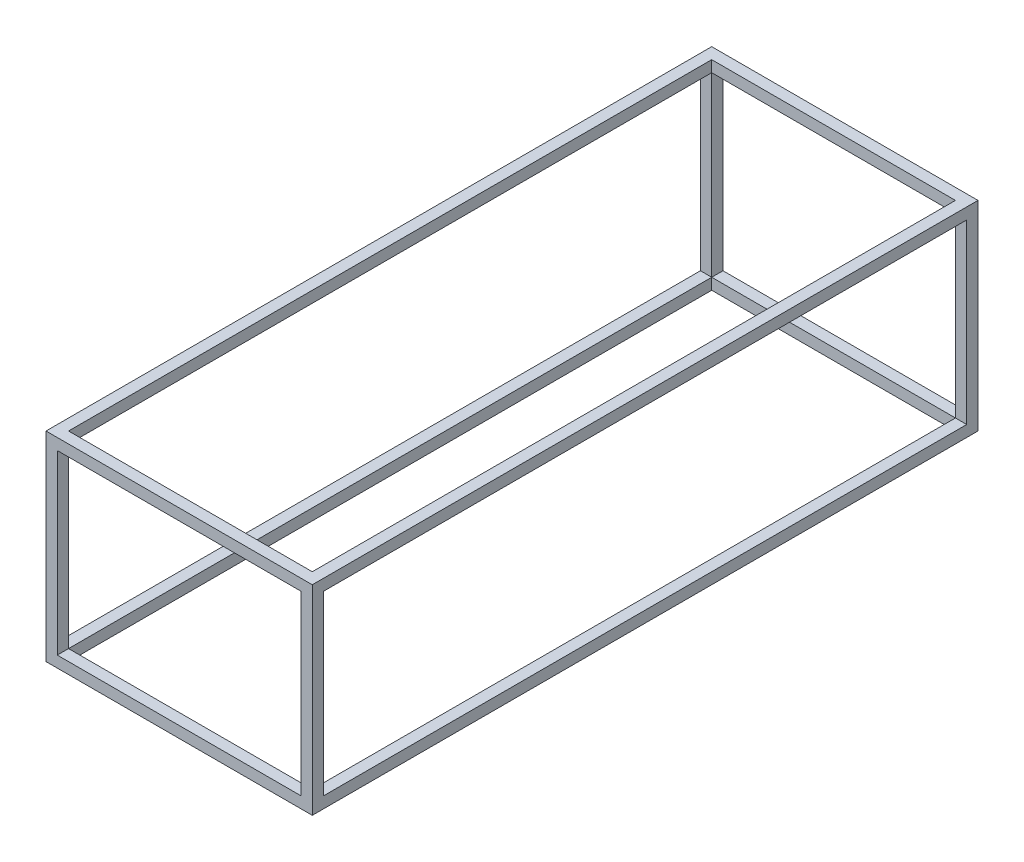
ISO-10303-21;
HEADER;
FILE_DESCRIPTION(('STEP AP214'),'2;1');
FILE_NAME('part.step','',(''),(''),'','','');
FILE_SCHEMA(('AUTOMOTIVE_DESIGN { 1 0 10303 214 1 1 1 1 }'));
ENDSEC;
DATA;
#1=APPLICATION_CONTEXT('core data for automotive mechanical design processes');
#2=APPLICATION_PROTOCOL_DEFINITION('international standard','automotive_design',2000,#1);
#3=PRODUCT_CONTEXT('',#1,'mechanical');
#4=PRODUCT('Part','Part','',(#3));
#5=PRODUCT_RELATED_PRODUCT_CATEGORY('part','',(#4));
#6=PRODUCT_DEFINITION_FORMATION('','',#4);
#7=PRODUCT_DEFINITION_CONTEXT('part definition',#1,'design');
#8=PRODUCT_DEFINITION('design','',#6,#7);
#9=PRODUCT_DEFINITION_SHAPE('','',#8);
#10=(LENGTH_UNIT() NAMED_UNIT(*) SI_UNIT(.MILLI.,.METRE.));
#11=(NAMED_UNIT(*) PLANE_ANGLE_UNIT() SI_UNIT($,.RADIAN.));
#12=(NAMED_UNIT(*) SI_UNIT($,.STERADIAN.) SOLID_ANGLE_UNIT());
#13=UNCERTAINTY_MEASURE_WITH_UNIT(LENGTH_MEASURE(1.E-05),#10,'distance_accuracy_value','');
#14=(GEOMETRIC_REPRESENTATION_CONTEXT(3) GLOBAL_UNCERTAINTY_ASSIGNED_CONTEXT((#13)) GLOBAL_UNIT_ASSIGNED_CONTEXT((#10,
#11,#12)) REPRESENTATION_CONTEXT('',''));
#15=CARTESIAN_POINT('',(0.,0.,0.));
#16=DIRECTION('',(0.,0.,1.));
#17=DIRECTION('',(1.,0.,0.));
#18=AXIS2_PLACEMENT_3D('',#15,#16,#17);
#19=CARTESIAN_POINT('',(25.4,424.6,1500.));
#20=DIRECTION('',(0.,-1.,0.));
#21=DIRECTION('',(0.,0.,-1.));
#22=AXIS2_PLACEMENT_3D('',#19,#20,#21);
#23=PLANE('',#22);
#24=DIRECTION('',(0.,0.,-1.));
#25=VECTOR('',#24,1.);
#26=CARTESIAN_POINT('',(25.4,424.6,1500.));
#27=LINE('',#26,#25);
#28=CARTESIAN_POINT('',(25.4,424.6,1474.6));
#29=VERTEX_POINT('',#28);
#30=CARTESIAN_POINT('',(25.4,424.6,25.4000000000001));
#31=VERTEX_POINT('',#30);
#32=EDGE_CURVE('E282',#29,#31,#27,.T.);
#33=ORIENTED_EDGE('',*,*,#32,.F.);
#34=DIRECTION('',(-1.,0.,0.));
#35=VECTOR('',#34,1.);
#36=CARTESIAN_POINT('',(25.4,424.6,1474.6));
#37=LINE('',#36,#35);
#38=CARTESIAN_POINT('',(0.,424.6,1474.6));
#39=VERTEX_POINT('',#38);
#40=EDGE_CURVE('E52',#29,#39,#37,.T.);
#41=ORIENTED_EDGE('',*,*,#40,.T.);
#42=DIRECTION('',(0.,0.,-1.));
#43=VECTOR('',#42,1.);
#44=CARTESIAN_POINT('',(0.,424.6,1500.));
#45=LINE('',#44,#43);
#46=CARTESIAN_POINT('',(0.,424.6,25.4));
#47=VERTEX_POINT('',#46);
#48=EDGE_CURVE('E286',#39,#47,#45,.T.);
#49=ORIENTED_EDGE('',*,*,#48,.T.);
#50=DIRECTION('',(-1.,0.,0.));
#51=VECTOR('',#50,1.);
#52=CARTESIAN_POINT('',(0.,424.6,25.4));
#53=LINE('',#52,#51);
#54=EDGE_CURVE('E291',#31,#47,#53,.T.);
#55=ORIENTED_EDGE('',*,*,#54,.F.);
#56=EDGE_LOOP('',(#33,#41,#49,#55));
#57=FACE_BOUND('',#56,.T.);
#58=ADVANCED_FACE('F37',(#57),#23,.T.);
#59=CARTESIAN_POINT('',(25.4,424.6,1500.));
#60=DIRECTION('',(1.,0.,0.));
#61=DIRECTION('',(0.,0.,-1.));
#62=AXIS2_PLACEMENT_3D('',#59,#60,#61);
#63=PLANE('',#62);
#64=DIRECTION('',(0.,0.,-1.));
#65=VECTOR('',#64,1.);
#66=CARTESIAN_POINT('',(25.4,450.,1500.));
#67=LINE('',#66,#65);
#68=CARTESIAN_POINT('',(25.4,450.,1474.6));
#69=VERTEX_POINT('',#68);
#70=CARTESIAN_POINT('',(25.4,450.,25.4000000000001));
#71=VERTEX_POINT('',#70);
#72=EDGE_CURVE('E283',#69,#71,#67,.T.);
#73=ORIENTED_EDGE('',*,*,#72,.F.);
#74=DIRECTION('',(0.,-1.,0.));
#75=VECTOR('',#74,1.);
#76=CARTESIAN_POINT('',(25.4,424.6,1474.6));
#77=LINE('',#76,#75);
#78=EDGE_CURVE('E60',#69,#29,#77,.T.);
#79=ORIENTED_EDGE('',*,*,#78,.T.);
#80=ORIENTED_EDGE('',*,*,#32,.T.);
#81=DIRECTION('',(0.,-1.,0.));
#82=VECTOR('',#81,1.);
#83=CARTESIAN_POINT('',(25.4,0.,25.4));
#84=LINE('',#83,#82);
#85=EDGE_CURVE('E285',#71,#31,#84,.T.);
#86=ORIENTED_EDGE('',*,*,#85,.F.);
#87=EDGE_LOOP('',(#73,#79,#80,#86));
#88=FACE_BOUND('',#87,.T.);
#89=ADVANCED_FACE('F394',(#88),#63,.T.);
#90=CARTESIAN_POINT('',(574.6,424.6,1500.));
#91=DIRECTION('',(0.,-1.,0.));
#92=DIRECTION('',(0.,0.,-1.));
#93=AXIS2_PLACEMENT_3D('',#90,#91,#92);
#94=PLANE('',#93);
#95=DIRECTION('',(0.,0.,-1.));
#96=VECTOR('',#95,1.);
#97=CARTESIAN_POINT('',(600.,424.6,1500.));
#98=LINE('',#97,#96);
#99=CARTESIAN_POINT('',(600.,424.6,1474.6));
#100=VERTEX_POINT('',#99);
#101=CARTESIAN_POINT('',(600.,424.6,25.4));
#102=VERTEX_POINT('',#101);
#103=EDGE_CURVE('E269',#100,#102,#98,.T.);
#104=ORIENTED_EDGE('',*,*,#103,.F.);
#105=DIRECTION('',(-1.,0.,0.));
#106=VECTOR('',#105,1.);
#107=CARTESIAN_POINT('',(574.6,424.6,1474.6));
#108=LINE('',#107,#106);
#109=CARTESIAN_POINT('',(574.6,424.6,1474.6));
#110=VERTEX_POINT('',#109);
#111=EDGE_CURVE('E232',#100,#110,#108,.T.);
#112=ORIENTED_EDGE('',*,*,#111,.T.);
#113=DIRECTION('',(0.,0.,-1.));
#114=VECTOR('',#113,1.);
#115=CARTESIAN_POINT('',(574.6,424.6,1500.));
#116=LINE('',#115,#114);
#117=CARTESIAN_POINT('',(574.6,424.6,25.4));
#118=VERTEX_POINT('',#117);
#119=EDGE_CURVE('E266',#110,#118,#116,.T.);
#120=ORIENTED_EDGE('',*,*,#119,.T.);
#121=DIRECTION('',(-1.,0.,0.));
#122=VECTOR('',#121,1.);
#123=CARTESIAN_POINT('',(0.,424.6,25.4));
#124=LINE('',#123,#122);
#125=EDGE_CURVE('E274',#102,#118,#124,.T.);
#126=ORIENTED_EDGE('',*,*,#125,.F.);
#127=EDGE_LOOP('',(#104,#112,#120,#126));
#128=FACE_BOUND('',#127,.T.);
#129=ADVANCED_FACE('F399',(#128),#94,.T.);
#130=CARTESIAN_POINT('',(574.6,424.6,1500.));
#131=DIRECTION('',(-1.,0.,0.));
#132=DIRECTION('',(0.,0.,1.));
#133=AXIS2_PLACEMENT_3D('',#130,#131,#132);
#134=PLANE('',#133);
#135=ORIENTED_EDGE('',*,*,#119,.F.);
#136=DIRECTION('',(0.,1.,0.));
#137=VECTOR('',#136,1.);
#138=CARTESIAN_POINT('',(574.6,424.6,1474.6));
#139=LINE('',#138,#137);
#140=CARTESIAN_POINT('',(574.6,450.,1474.6));
#141=VERTEX_POINT('',#140);
#142=EDGE_CURVE('E230',#110,#141,#139,.T.);
#143=ORIENTED_EDGE('',*,*,#142,.T.);
#144=DIRECTION('',(0.,0.,-1.));
#145=VECTOR('',#144,1.);
#146=CARTESIAN_POINT('',(574.6,450.,1500.));
#147=LINE('',#146,#145);
#148=CARTESIAN_POINT('',(574.6,450.,25.4000000000001));
#149=VERTEX_POINT('',#148);
#150=EDGE_CURVE('E265',#141,#149,#147,.T.);
#151=ORIENTED_EDGE('',*,*,#150,.T.);
#152=DIRECTION('',(0.,1.,0.));
#153=VECTOR('',#152,1.);
#154=CARTESIAN_POINT('',(574.6,0.,25.4));
#155=LINE('',#154,#153);
#156=EDGE_CURVE('E268',#118,#149,#155,.T.);
#157=ORIENTED_EDGE('',*,*,#156,.F.);
#158=EDGE_LOOP('',(#135,#143,#151,#157));
#159=FACE_BOUND('',#158,.T.);
#160=ADVANCED_FACE('F494',(#159),#134,.T.);
#161=CARTESIAN_POINT('',(574.6,25.4,1500.));
#162=DIRECTION('',(-1.,0.,0.));
#163=DIRECTION('',(0.,0.,1.));
#164=AXIS2_PLACEMENT_3D('',#161,#162,#163);
#165=PLANE('',#164);
#166=DIRECTION('',(0.,0.,-1.));
#167=VECTOR('',#166,1.);
#168=CARTESIAN_POINT('',(574.6,0.,1500.));
#169=LINE('',#168,#167);
#170=CARTESIAN_POINT('',(574.6,0.,1474.6));
#171=VERTEX_POINT('',#170);
#172=CARTESIAN_POINT('',(574.6,0.,25.4000000000001));
#173=VERTEX_POINT('',#172);
#174=EDGE_CURVE('E252',#171,#173,#169,.T.);
#175=ORIENTED_EDGE('',*,*,#174,.F.);
#176=DIRECTION('',(0.,1.,0.));
#177=VECTOR('',#176,1.);
#178=CARTESIAN_POINT('',(574.6,25.4,1474.6));
#179=LINE('',#178,#177);
#180=CARTESIAN_POINT('',(574.6,25.4,1474.6));
#181=VERTEX_POINT('',#180);
#182=EDGE_CURVE('E228',#171,#181,#179,.T.);
#183=ORIENTED_EDGE('',*,*,#182,.T.);
#184=DIRECTION('',(0.,0.,-1.));
#185=VECTOR('',#184,1.);
#186=CARTESIAN_POINT('',(574.6,25.4,1500.));
#187=LINE('',#186,#185);
#188=CARTESIAN_POINT('',(574.6,25.4,25.4000000000001));
#189=VERTEX_POINT('',#188);
#190=EDGE_CURVE('E251',#181,#189,#187,.T.);
#191=ORIENTED_EDGE('',*,*,#190,.T.);
#192=DIRECTION('',(0.,1.,0.));
#193=VECTOR('',#192,1.);
#194=CARTESIAN_POINT('',(574.6,0.,25.4));
#195=LINE('',#194,#193);
#196=EDGE_CURVE('E260',#173,#189,#195,.T.);
#197=ORIENTED_EDGE('',*,*,#196,.F.);
#198=EDGE_LOOP('',(#175,#183,#191,#197));
#199=FACE_BOUND('',#198,.T.);
#200=ADVANCED_FACE('F490',(#199),#165,.T.);
#201=CARTESIAN_POINT('',(574.6,25.4,1500.));
#202=DIRECTION('',(0.,1.,0.));
#203=DIRECTION('',(0.,0.,1.));
#204=AXIS2_PLACEMENT_3D('',#201,#202,#203);
#205=PLANE('',#204);
#206=ORIENTED_EDGE('',*,*,#190,.F.);
#207=DIRECTION('',(1.,0.,0.));
#208=VECTOR('',#207,1.);
#209=CARTESIAN_POINT('',(574.6,25.4,1474.6));
#210=LINE('',#209,#208);
#211=CARTESIAN_POINT('',(600.,25.4,1474.6));
#212=VERTEX_POINT('',#211);
#213=EDGE_CURVE('E226',#181,#212,#210,.T.);
#214=ORIENTED_EDGE('',*,*,#213,.T.);
#215=DIRECTION('',(0.,0.,-1.));
#216=VECTOR('',#215,1.);
#217=CARTESIAN_POINT('',(600.,25.4,1500.));
#218=LINE('',#217,#216);
#219=CARTESIAN_POINT('',(600.,25.4,25.4));
#220=VERTEX_POINT('',#219);
#221=EDGE_CURVE('E255',#212,#220,#218,.T.);
#222=ORIENTED_EDGE('',*,*,#221,.T.);
#223=DIRECTION('',(1.,0.,0.));
#224=VECTOR('',#223,1.);
#225=CARTESIAN_POINT('',(0.,25.4,25.4));
#226=LINE('',#225,#224);
#227=EDGE_CURVE('E254',#189,#220,#226,.T.);
#228=ORIENTED_EDGE('',*,*,#227,.F.);
#229=EDGE_LOOP('',(#206,#214,#222,#228));
#230=FACE_BOUND('',#229,.T.);
#231=ADVANCED_FACE('F487',(#230),#205,.T.);
#232=CARTESIAN_POINT('',(0.,25.4,1500.));
#233=DIRECTION('',(0.,1.,0.));
#234=DIRECTION('',(0.,0.,1.));
#235=AXIS2_PLACEMENT_3D('',#232,#233,#234);
#236=PLANE('',#235);
#237=DIRECTION('',(0.,0.,-1.));
#238=VECTOR('',#237,1.);
#239=CARTESIAN_POINT('',(0.,25.4,1500.));
#240=LINE('',#239,#238);
#241=CARTESIAN_POINT('',(0.,25.4,1474.6));
#242=VERTEX_POINT('',#241);
#243=CARTESIAN_POINT('',(0.,25.4,25.4000000000001));
#244=VERTEX_POINT('',#243);
#245=EDGE_CURVE('E236',#242,#244,#240,.T.);
#246=ORIENTED_EDGE('',*,*,#245,.F.);
#247=DIRECTION('',(1.,0.,0.));
#248=VECTOR('',#247,1.);
#249=CARTESIAN_POINT('',(0.,25.4,1474.6));
#250=LINE('',#249,#248);
#251=CARTESIAN_POINT('',(25.4,25.4,1474.6));
#252=VERTEX_POINT('',#251);
#253=EDGE_CURVE('E224',#242,#252,#250,.T.);
#254=ORIENTED_EDGE('',*,*,#253,.T.);
#255=DIRECTION('',(0.,0.,-1.));
#256=VECTOR('',#255,1.);
#257=CARTESIAN_POINT('',(25.4,25.4,1500.));
#258=LINE('',#257,#256);
#259=CARTESIAN_POINT('',(25.4,25.4,25.4));
#260=VERTEX_POINT('',#259);
#261=EDGE_CURVE('E240',#252,#260,#258,.T.);
#262=ORIENTED_EDGE('',*,*,#261,.T.);
#263=DIRECTION('',(1.,0.,0.));
#264=VECTOR('',#263,1.);
#265=CARTESIAN_POINT('',(0.,25.4,25.4));
#266=LINE('',#265,#264);
#267=EDGE_CURVE('E245',#244,#260,#266,.T.);
#268=ORIENTED_EDGE('',*,*,#267,.F.);
#269=EDGE_LOOP('',(#246,#254,#262,#268));
#270=FACE_BOUND('',#269,.T.);
#271=ADVANCED_FACE('F437',(#270),#236,.T.);
#272=CARTESIAN_POINT('',(25.4,0.,1500.));
#273=DIRECTION('',(1.,0.,0.));
#274=DIRECTION('',(0.,0.,-1.));
#275=AXIS2_PLACEMENT_3D('',#272,#273,#274);
#276=PLANE('',#275);
#277=ORIENTED_EDGE('',*,*,#261,.F.);
#278=DIRECTION('',(0.,-1.,0.));
#279=VECTOR('',#278,1.);
#280=CARTESIAN_POINT('',(25.4,0.,1474.6));
#281=LINE('',#280,#279);
#282=CARTESIAN_POINT('',(25.4,0.,1474.6));
#283=VERTEX_POINT('',#282);
#284=EDGE_CURVE('E11',#252,#283,#281,.T.);
#285=ORIENTED_EDGE('',*,*,#284,.T.);
#286=DIRECTION('',(0.,0.,-1.));
#287=VECTOR('',#286,1.);
#288=CARTESIAN_POINT('',(25.4,0.,1500.));
#289=LINE('',#288,#287);
#290=CARTESIAN_POINT('',(25.4,0.,25.4000000000001));
#291=VERTEX_POINT('',#290);
#292=EDGE_CURVE('E237',#283,#291,#289,.T.);
#293=ORIENTED_EDGE('',*,*,#292,.T.);
#294=DIRECTION('',(0.,-1.,0.));
#295=VECTOR('',#294,1.);
#296=CARTESIAN_POINT('',(25.4,0.,25.4));
#297=LINE('',#296,#295);
#298=EDGE_CURVE('E239',#260,#291,#297,.T.);
#299=ORIENTED_EDGE('',*,*,#298,.F.);
#300=EDGE_LOOP('',(#277,#285,#293,#299));
#301=FACE_BOUND('',#300,.T.);
#302=ADVANCED_FACE('F442',(#301),#276,.T.);
#303=CARTESIAN_POINT('',(0.,0.,25.4));
#304=DIRECTION('',(0.,0.,-1.));
#305=DIRECTION('',(-1.,0.,0.));
#306=AXIS2_PLACEMENT_3D('',#303,#304,#305);
#307=PLANE('',#306);
#308=DIRECTION('',(1.,0.,0.));
#309=VECTOR('',#308,1.);
#310=CARTESIAN_POINT('',(25.4,25.4,25.4));
#311=LINE('',#310,#309);
#312=EDGE_CURVE('E298',#260,#189,#311,.T.);
#313=ORIENTED_EDGE('',*,*,#312,.F.);
#314=ORIENTED_EDGE('',*,*,#298,.T.);
#315=DIRECTION('',(1.,0.,0.));
#316=VECTOR('',#315,1.);
#317=CARTESIAN_POINT('',(0.,0.,25.4));
#318=LINE('',#317,#316);
#319=EDGE_CURVE('E332',#291,#173,#318,.T.);
#320=ORIENTED_EDGE('',*,*,#319,.T.);
#321=ORIENTED_EDGE('',*,*,#196,.T.);
#322=EDGE_LOOP('',(#313,#314,#320,#321));
#323=FACE_BOUND('',#322,.T.);
#324=ADVANCED_FACE('F419',(#323),#307,.F.);
#325=DIRECTION('',(0.,-1.,0.));
#326=VECTOR('',#325,1.);
#327=CARTESIAN_POINT('',(0.,0.,25.4));
#328=LINE('',#327,#326);
#329=EDGE_CURVE('E329',#47,#244,#328,.T.);
#330=ORIENTED_EDGE('',*,*,#329,.T.);
#331=ORIENTED_EDGE('',*,*,#267,.T.);
#332=DIRECTION('',(0.,-1.,0.));
#333=VECTOR('',#332,1.);
#334=CARTESIAN_POINT('',(25.4,25.4,25.4));
#335=LINE('',#334,#333);
#336=EDGE_CURVE('E295',#31,#260,#335,.T.);
#337=ORIENTED_EDGE('',*,*,#336,.F.);
#338=ORIENTED_EDGE('',*,*,#54,.T.);
#339=EDGE_LOOP('',(#330,#331,#337,#338));
#340=FACE_BOUND('',#339,.T.);
#341=ADVANCED_FACE('F516',(#340),#307,.F.);
#342=DIRECTION('',(-1.,0.,0.));
#343=VECTOR('',#342,1.);
#344=CARTESIAN_POINT('',(25.4,424.6,25.4));
#345=LINE('',#344,#343);
#346=EDGE_CURVE('E305',#118,#31,#345,.T.);
#347=ORIENTED_EDGE('',*,*,#346,.F.);
#348=ORIENTED_EDGE('',*,*,#156,.T.);
#349=DIRECTION('',(-1.,0.,0.));
#350=VECTOR('',#349,1.);
#351=CARTESIAN_POINT('',(0.,450.,25.4));
#352=LINE('',#351,#350);
#353=EDGE_CURVE('E339',#149,#71,#352,.T.);
#354=ORIENTED_EDGE('',*,*,#353,.T.);
#355=ORIENTED_EDGE('',*,*,#85,.T.);
#356=EDGE_LOOP('',(#347,#348,#354,#355));
#357=FACE_BOUND('',#356,.T.);
#358=ADVANCED_FACE('F417',(#357),#307,.F.);
#359=DIRECTION('',(0.,1.,0.));
#360=VECTOR('',#359,1.);
#361=CARTESIAN_POINT('',(574.6,25.4,25.4));
#362=LINE('',#361,#360);
#363=EDGE_CURVE('E302',#189,#118,#362,.T.);
#364=ORIENTED_EDGE('',*,*,#363,.F.);
#365=ORIENTED_EDGE('',*,*,#227,.T.);
#366=DIRECTION('',(0.,1.,0.));
#367=VECTOR('',#366,1.);
#368=CARTESIAN_POINT('',(600.,0.,25.4));
#369=LINE('',#368,#367);
#370=EDGE_CURVE('E336',#220,#102,#369,.T.);
#371=ORIENTED_EDGE('',*,*,#370,.T.);
#372=ORIENTED_EDGE('',*,*,#125,.T.);
#373=EDGE_LOOP('',(#364,#365,#371,#372));
#374=FACE_BOUND('',#373,.T.);
#375=ADVANCED_FACE('F415',(#374),#307,.F.);
#376=CARTESIAN_POINT('',(0.,0.,0.));
#377=DIRECTION('',(0.,0.,-1.));
#378=DIRECTION('',(-1.,0.,0.));
#379=AXIS2_PLACEMENT_3D('',#376,#377,#378);
#380=PLANE('',#379);
#381=DIRECTION('',(0.,1.,0.));
#382=VECTOR('',#381,1.);
#383=CARTESIAN_POINT('',(600.,0.,0.));
#384=LINE('',#383,#382);
#385=CARTESIAN_POINT('',(600.,0.,0.));
#386=VERTEX_POINT('',#385);
#387=CARTESIAN_POINT('',(600.,450.,0.));
#388=VERTEX_POINT('',#387);
#389=EDGE_CURVE('E348',#386,#388,#384,.T.);
#390=ORIENTED_EDGE('',*,*,#389,.F.);
#391=DIRECTION('',(1.,0.,0.));
#392=VECTOR('',#391,1.);
#393=CARTESIAN_POINT('',(0.,0.,0.));
#394=LINE('',#393,#392);
#395=CARTESIAN_POINT('',(0.,0.,0.));
#396=VERTEX_POINT('',#395);
#397=EDGE_CURVE('E345',#396,#386,#394,.T.);
#398=ORIENTED_EDGE('',*,*,#397,.F.);
#399=DIRECTION('',(0.,-1.,0.));
#400=VECTOR('',#399,1.);
#401=CARTESIAN_POINT('',(0.,0.,0.));
#402=LINE('',#401,#400);
#403=CARTESIAN_POINT('',(0.,450.,0.));
#404=VERTEX_POINT('',#403);
#405=EDGE_CURVE('E328',#404,#396,#402,.T.);
#406=ORIENTED_EDGE('',*,*,#405,.F.);
#407=DIRECTION('',(-1.,0.,0.));
#408=VECTOR('',#407,1.);
#409=CARTESIAN_POINT('',(0.,450.,0.));
#410=LINE('',#409,#408);
#411=EDGE_CURVE('E333',#388,#404,#410,.T.);
#412=ORIENTED_EDGE('',*,*,#411,.F.);
#413=EDGE_LOOP('',(#390,#398,#406,#412));
#414=FACE_BOUND('',#413,.T.);
#415=DIRECTION('',(0.,-1.,0.));
#416=VECTOR('',#415,1.);
#417=CARTESIAN_POINT('',(25.4,25.4,0.));
#418=LINE('',#417,#416);
#419=CARTESIAN_POINT('',(25.4,424.6,0.));
#420=VERTEX_POINT('',#419);
#421=CARTESIAN_POINT('',(25.4,25.4,0.));
#422=VERTEX_POINT('',#421);
#423=EDGE_CURVE('E294',#420,#422,#418,.T.);
#424=ORIENTED_EDGE('',*,*,#423,.T.);
#425=DIRECTION('',(1.,0.,0.));
#426=VECTOR('',#425,1.);
#427=CARTESIAN_POINT('',(25.4,25.4,0.));
#428=LINE('',#427,#426);
#429=CARTESIAN_POINT('',(574.6,25.4,0.));
#430=VERTEX_POINT('',#429);
#431=EDGE_CURVE('E311',#422,#430,#428,.T.);
#432=ORIENTED_EDGE('',*,*,#431,.T.);
#433=DIRECTION('',(0.,1.,0.));
#434=VECTOR('',#433,1.);
#435=CARTESIAN_POINT('',(574.6,25.4,0.));
#436=LINE('',#435,#434);
#437=CARTESIAN_POINT('',(574.6,424.6,0.));
#438=VERTEX_POINT('',#437);
#439=EDGE_CURVE('E314',#430,#438,#436,.T.);
#440=ORIENTED_EDGE('',*,*,#439,.T.);
#441=DIRECTION('',(-1.,0.,0.));
#442=VECTOR('',#441,1.);
#443=CARTESIAN_POINT('',(25.4,424.6,0.));
#444=LINE('',#443,#442);
#445=EDGE_CURVE('E299',#438,#420,#444,.T.);
#446=ORIENTED_EDGE('',*,*,#445,.T.);
#447=EDGE_LOOP('',(#424,#432,#440,#446));
#448=FACE_BOUND('',#447,.T.);
#449=ADVANCED_FACE('F368',(#414,#448),#380,.T.);
#450=CARTESIAN_POINT('',(0.,0.,25.4));
#451=DIRECTION('',(1.,0.,0.));
#452=DIRECTION('',(0.,0.,-1.));
#453=AXIS2_PLACEMENT_3D('',#450,#451,#452);
#454=PLANE('',#453);
#455=ORIENTED_EDGE('',*,*,#48,.F.);
#456=DIRECTION('',(0.,-1.,0.));
#457=VECTOR('',#456,1.);
#458=CARTESIAN_POINT('',(0.,450.,1474.6));
#459=LINE('',#458,#457);
#460=EDGE_CURVE('E215',#39,#242,#459,.T.);
#461=ORIENTED_EDGE('',*,*,#460,.T.);
#462=ORIENTED_EDGE('',*,*,#245,.T.);
#463=ORIENTED_EDGE('',*,*,#329,.F.);
#464=EDGE_LOOP('',(#455,#461,#462,#463));
#465=FACE_BOUND('',#464,.T.);
#466=DIRECTION('',(0.,0.,-1.));
#467=VECTOR('',#466,1.);
#468=CARTESIAN_POINT('',(0.,0.,25.4));
#469=LINE('',#468,#467);
#470=CARTESIAN_POINT('',(0.,0.,1500.));
#471=VERTEX_POINT('',#470);
#472=EDGE_CURVE('E45',#471,#396,#469,.T.);
#473=ORIENTED_EDGE('',*,*,#472,.F.);
#474=DIRECTION('',(0.,1.,0.));
#475=VECTOR('',#474,1.);
#476=CARTESIAN_POINT('',(0.,424.6,1500.));
#477=LINE('',#476,#475);
#478=CARTESIAN_POINT('',(0.,450.,1500.));
#479=VERTEX_POINT('',#478);
#480=EDGE_CURVE('E277',#471,#479,#477,.T.);
#481=ORIENTED_EDGE('',*,*,#480,.T.);
#482=DIRECTION('',(0.,0.,-1.));
#483=VECTOR('',#482,1.);
#484=CARTESIAN_POINT('',(0.,450.,25.4));
#485=LINE('',#484,#483);
#486=EDGE_CURVE('E342',#479,#404,#485,.T.);
#487=ORIENTED_EDGE('',*,*,#486,.T.);
#488=ORIENTED_EDGE('',*,*,#405,.T.);
#489=EDGE_LOOP('',(#473,#481,#487,#488));
#490=FACE_BOUND('',#489,.T.);
#491=ADVANCED_FACE('F39',(#465,#490),#454,.F.);
#492=CARTESIAN_POINT('',(0.,0.,25.4));
#493=DIRECTION('',(0.,1.,0.));
#494=DIRECTION('',(0.,0.,1.));
#495=AXIS2_PLACEMENT_3D('',#492,#493,#494);
#496=PLANE('',#495);
#497=ORIENTED_EDGE('',*,*,#292,.F.);
#498=DIRECTION('',(1.,0.,0.));
#499=VECTOR('',#498,1.);
#500=CARTESIAN_POINT('',(0.,0.,1474.6));
#501=LINE('',#500,#499);
#502=EDGE_CURVE('E218',#283,#171,#501,.T.);
#503=ORIENTED_EDGE('',*,*,#502,.T.);
#504=ORIENTED_EDGE('',*,*,#174,.T.);
#505=ORIENTED_EDGE('',*,*,#319,.F.);
#506=EDGE_LOOP('',(#497,#503,#504,#505));
#507=FACE_BOUND('',#506,.T.);
#508=DIRECTION('',(-1.,0.,0.));
#509=VECTOR('',#508,1.);
#510=CARTESIAN_POINT('',(574.6,0.,1500.));
#511=LINE('',#510,#509);
#512=CARTESIAN_POINT('',(600.,0.,1500.));
#513=VERTEX_POINT('',#512);
#514=EDGE_CURVE('E248',#513,#471,#511,.T.);
#515=ORIENTED_EDGE('',*,*,#514,.T.);
#516=ORIENTED_EDGE('',*,*,#472,.T.);
#517=ORIENTED_EDGE('',*,*,#397,.T.);
#518=DIRECTION('',(0.,0.,-1.));
#519=VECTOR('',#518,1.);
#520=CARTESIAN_POINT('',(600.,0.,25.4));
#521=LINE('',#520,#519);
#522=EDGE_CURVE('E356',#513,#386,#521,.T.);
#523=ORIENTED_EDGE('',*,*,#522,.F.);
#524=EDGE_LOOP('',(#515,#516,#517,#523));
#525=FACE_BOUND('',#524,.T.);
#526=ADVANCED_FACE('F359',(#507,#525),#496,.F.);
#527=CARTESIAN_POINT('',(600.,0.,25.4));
#528=DIRECTION('',(-1.,0.,0.));
#529=DIRECTION('',(0.,0.,1.));
#530=AXIS2_PLACEMENT_3D('',#527,#528,#529);
#531=PLANE('',#530);
#532=ORIENTED_EDGE('',*,*,#221,.F.);
#533=DIRECTION('',(0.,1.,0.));
#534=VECTOR('',#533,1.);
#535=CARTESIAN_POINT('',(600.,0.,1474.6));
#536=LINE('',#535,#534);
#537=EDGE_CURVE('E221',#212,#100,#536,.T.);
#538=ORIENTED_EDGE('',*,*,#537,.T.);
#539=ORIENTED_EDGE('',*,*,#103,.T.);
#540=ORIENTED_EDGE('',*,*,#370,.F.);
#541=EDGE_LOOP('',(#532,#538,#539,#540));
#542=FACE_BOUND('',#541,.T.);
#543=DIRECTION('',(0.,-1.,0.));
#544=VECTOR('',#543,1.);
#545=CARTESIAN_POINT('',(600.,424.6,1500.));
#546=LINE('',#545,#544);
#547=CARTESIAN_POINT('',(600.,450.,1500.));
#548=VERTEX_POINT('',#547);
#549=EDGE_CURVE('E263',#548,#513,#546,.T.);
#550=ORIENTED_EDGE('',*,*,#549,.T.);
#551=ORIENTED_EDGE('',*,*,#522,.T.);
#552=ORIENTED_EDGE('',*,*,#389,.T.);
#553=DIRECTION('',(0.,0.,-1.));
#554=VECTOR('',#553,1.);
#555=CARTESIAN_POINT('',(600.,450.,25.4));
#556=LINE('',#555,#554);
#557=EDGE_CURVE('E354',#548,#388,#556,.T.);
#558=ORIENTED_EDGE('',*,*,#557,.F.);
#559=EDGE_LOOP('',(#550,#551,#552,#558));
#560=FACE_BOUND('',#559,.T.);
#561=ADVANCED_FACE('F372',(#542,#560),#531,.F.);
#562=CARTESIAN_POINT('',(0.,450.,25.4));
#563=DIRECTION('',(0.,-1.,0.));
#564=DIRECTION('',(0.,0.,-1.));
#565=AXIS2_PLACEMENT_3D('',#562,#563,#564);
#566=PLANE('',#565);
#567=ORIENTED_EDGE('',*,*,#150,.F.);
#568=DIRECTION('',(-1.,0.,0.));
#569=VECTOR('',#568,1.);
#570=CARTESIAN_POINT('',(600.,450.,1474.6));
#571=LINE('',#570,#569);
#572=EDGE_CURVE('E185',#141,#69,#571,.T.);
#573=ORIENTED_EDGE('',*,*,#572,.T.);
#574=ORIENTED_EDGE('',*,*,#72,.T.);
#575=ORIENTED_EDGE('',*,*,#353,.F.);
#576=EDGE_LOOP('',(#567,#573,#574,#575));
#577=FACE_BOUND('',#576,.T.);
#578=DIRECTION('',(1.,0.,0.));
#579=VECTOR('',#578,1.);
#580=CARTESIAN_POINT('',(25.4,450.,1500.));
#581=LINE('',#580,#579);
#582=EDGE_CURVE('E280',#479,#548,#581,.T.);
#583=ORIENTED_EDGE('',*,*,#582,.T.);
#584=ORIENTED_EDGE('',*,*,#557,.T.);
#585=ORIENTED_EDGE('',*,*,#411,.T.);
#586=ORIENTED_EDGE('',*,*,#486,.F.);
#587=EDGE_LOOP('',(#583,#584,#585,#586));
#588=FACE_BOUND('',#587,.T.);
#589=ADVANCED_FACE('F377',(#577,#588),#566,.F.);
#590=CARTESIAN_POINT('',(25.4,25.4,25.4));
#591=DIRECTION('',(1.,0.,0.));
#592=DIRECTION('',(0.,0.,-1.));
#593=AXIS2_PLACEMENT_3D('',#590,#591,#592);
#594=PLANE('',#593);
#595=ORIENTED_EDGE('',*,*,#423,.F.);
#596=DIRECTION('',(0.,0.,-1.));
#597=VECTOR('',#596,1.);
#598=CARTESIAN_POINT('',(25.4,424.6,25.4));
#599=LINE('',#598,#597);
#600=EDGE_CURVE('E308',#31,#420,#599,.T.);
#601=ORIENTED_EDGE('',*,*,#600,.F.);
#602=ORIENTED_EDGE('',*,*,#336,.T.);
#603=DIRECTION('',(0.,0.,-1.));
#604=VECTOR('',#603,1.);
#605=CARTESIAN_POINT('',(25.4,25.4,25.4));
#606=LINE('',#605,#604);
#607=EDGE_CURVE('E325',#260,#422,#606,.T.);
#608=ORIENTED_EDGE('',*,*,#607,.T.);
#609=EDGE_LOOP('',(#595,#601,#602,#608));
#610=FACE_BOUND('',#609,.T.);
#611=ADVANCED_FACE('F379',(#610),#594,.T.);
#612=CARTESIAN_POINT('',(25.4,25.4,25.4));
#613=DIRECTION('',(0.,1.,0.));
#614=DIRECTION('',(0.,0.,1.));
#615=AXIS2_PLACEMENT_3D('',#612,#613,#614);
#616=PLANE('',#615);
#617=ORIENTED_EDGE('',*,*,#431,.F.);
#618=ORIENTED_EDGE('',*,*,#607,.F.);
#619=ORIENTED_EDGE('',*,*,#312,.T.);
#620=DIRECTION('',(0.,0.,-1.));
#621=VECTOR('',#620,1.);
#622=CARTESIAN_POINT('',(574.6,25.4,25.4));
#623=LINE('',#622,#621);
#624=EDGE_CURVE('E323',#189,#430,#623,.T.);
#625=ORIENTED_EDGE('',*,*,#624,.T.);
#626=EDGE_LOOP('',(#617,#618,#619,#625));
#627=FACE_BOUND('',#626,.T.);
#628=ADVANCED_FACE('F386',(#627),#616,.T.);
#629=CARTESIAN_POINT('',(574.6,25.4,25.4));
#630=DIRECTION('',(-1.,0.,0.));
#631=DIRECTION('',(0.,0.,1.));
#632=AXIS2_PLACEMENT_3D('',#629,#630,#631);
#633=PLANE('',#632);
#634=ORIENTED_EDGE('',*,*,#439,.F.);
#635=ORIENTED_EDGE('',*,*,#624,.F.);
#636=ORIENTED_EDGE('',*,*,#363,.T.);
#637=DIRECTION('',(0.,0.,-1.));
#638=VECTOR('',#637,1.);
#639=CARTESIAN_POINT('',(574.6,424.6,25.4));
#640=LINE('',#639,#638);
#641=EDGE_CURVE('E321',#118,#438,#640,.T.);
#642=ORIENTED_EDGE('',*,*,#641,.T.);
#643=EDGE_LOOP('',(#634,#635,#636,#642));
#644=FACE_BOUND('',#643,.T.);
#645=ADVANCED_FACE('F407',(#644),#633,.T.);
#646=CARTESIAN_POINT('',(25.4,424.6,25.4));
#647=DIRECTION('',(0.,-1.,0.));
#648=DIRECTION('',(0.,0.,-1.));
#649=AXIS2_PLACEMENT_3D('',#646,#647,#648);
#650=PLANE('',#649);
#651=ORIENTED_EDGE('',*,*,#445,.F.);
#652=ORIENTED_EDGE('',*,*,#641,.F.);
#653=ORIENTED_EDGE('',*,*,#346,.T.);
#654=ORIENTED_EDGE('',*,*,#600,.T.);
#655=EDGE_LOOP('',(#651,#652,#653,#654));
#656=FACE_BOUND('',#655,.T.);
#657=ADVANCED_FACE('F404',(#656),#650,.T.);
#658=CARTESIAN_POINT('',(0.,0.,1500.));
#659=DIRECTION('',(0.,0.,1.));
#660=DIRECTION('',(1.,0.,0.));
#661=AXIS2_PLACEMENT_3D('',#658,#659,#660);
#662=PLANE('',#661);
#663=ORIENTED_EDGE('',*,*,#480,.F.);
#664=ORIENTED_EDGE('',*,*,#514,.F.);
#665=ORIENTED_EDGE('',*,*,#549,.F.);
#666=ORIENTED_EDGE('',*,*,#582,.F.);
#667=EDGE_LOOP('',(#663,#664,#665,#666));
#668=FACE_BOUND('',#667,.T.);
#669=DIRECTION('',(0.,-1.,0.));
#670=VECTOR('',#669,1.);
#671=CARTESIAN_POINT('',(25.4,424.6,1500.));
#672=LINE('',#671,#670);
#673=CARTESIAN_POINT('',(25.4,424.6,1500.));
#674=VERTEX_POINT('',#673);
#675=CARTESIAN_POINT('',(25.4,25.4,1500.));
#676=VERTEX_POINT('',#675);
#677=EDGE_CURVE('E178',#674,#676,#672,.T.);
#678=ORIENTED_EDGE('',*,*,#677,.F.);
#679=DIRECTION('',(-1.,0.,0.));
#680=VECTOR('',#679,1.);
#681=CARTESIAN_POINT('',(25.4,424.6,1500.));
#682=LINE('',#681,#680);
#683=CARTESIAN_POINT('',(574.6,424.6,1500.));
#684=VERTEX_POINT('',#683);
#685=EDGE_CURVE('E189',#684,#674,#682,.T.);
#686=ORIENTED_EDGE('',*,*,#685,.F.);
#687=DIRECTION('',(0.,1.,0.));
#688=VECTOR('',#687,1.);
#689=CARTESIAN_POINT('',(574.6,424.6,1500.));
#690=LINE('',#689,#688);
#691=CARTESIAN_POINT('',(574.6,25.4,1500.));
#692=VERTEX_POINT('',#691);
#693=EDGE_CURVE('E195',#692,#684,#690,.T.);
#694=ORIENTED_EDGE('',*,*,#693,.F.);
#695=DIRECTION('',(1.,0.,0.));
#696=VECTOR('',#695,1.);
#697=CARTESIAN_POINT('',(25.4,25.4,1500.));
#698=LINE('',#697,#696);
#699=EDGE_CURVE('E200',#676,#692,#698,.T.);
#700=ORIENTED_EDGE('',*,*,#699,.F.);
#701=EDGE_LOOP('',(#678,#686,#694,#700));
#702=FACE_BOUND('',#701,.T.);
#703=ADVANCED_FACE('F198',(#668,#702),#662,.T.);
#704=CARTESIAN_POINT('',(0.,0.,1474.6));
#705=DIRECTION('',(0.,0.,1.));
#706=DIRECTION('',(1.,0.,0.));
#707=AXIS2_PLACEMENT_3D('',#704,#705,#706);
#708=PLANE('',#707);
#709=ORIENTED_EDGE('',*,*,#40,.F.);
#710=DIRECTION('',(0.,-1.,0.));
#711=VECTOR('',#710,1.);
#712=CARTESIAN_POINT('',(25.4,424.6,1474.6));
#713=LINE('',#712,#711);
#714=EDGE_CURVE('E181',#29,#252,#713,.T.);
#715=ORIENTED_EDGE('',*,*,#714,.T.);
#716=ORIENTED_EDGE('',*,*,#253,.F.);
#717=ORIENTED_EDGE('',*,*,#460,.F.);
#718=EDGE_LOOP('',(#709,#715,#716,#717));
#719=FACE_BOUND('',#718,.T.);
#720=ADVANCED_FACE('F434',(#719),#708,.F.);
#721=ORIENTED_EDGE('',*,*,#111,.F.);
#722=ORIENTED_EDGE('',*,*,#537,.F.);
#723=ORIENTED_EDGE('',*,*,#213,.F.);
#724=DIRECTION('',(0.,1.,0.));
#725=VECTOR('',#724,1.);
#726=CARTESIAN_POINT('',(574.6,424.6,1474.6));
#727=LINE('',#726,#725);
#728=EDGE_CURVE('E454',#181,#110,#727,.T.);
#729=ORIENTED_EDGE('',*,*,#728,.T.);
#730=EDGE_LOOP('',(#721,#722,#723,#729));
#731=FACE_BOUND('',#730,.T.);
#732=ADVANCED_FACE('F526',(#731),#708,.F.);
#733=ORIENTED_EDGE('',*,*,#182,.F.);
#734=ORIENTED_EDGE('',*,*,#502,.F.);
#735=ORIENTED_EDGE('',*,*,#284,.F.);
#736=DIRECTION('',(1.,0.,0.));
#737=VECTOR('',#736,1.);
#738=CARTESIAN_POINT('',(25.4,25.4,1474.6));
#739=LINE('',#738,#737);
#740=EDGE_CURVE('E450',#252,#181,#739,.T.);
#741=ORIENTED_EDGE('',*,*,#740,.T.);
#742=EDGE_LOOP('',(#733,#734,#735,#741));
#743=FACE_BOUND('',#742,.T.);
#744=ADVANCED_FACE('F448',(#743),#708,.F.);
#745=ORIENTED_EDGE('',*,*,#78,.F.);
#746=ORIENTED_EDGE('',*,*,#572,.F.);
#747=ORIENTED_EDGE('',*,*,#142,.F.);
#748=DIRECTION('',(-1.,0.,0.));
#749=VECTOR('',#748,1.);
#750=CARTESIAN_POINT('',(25.4,424.6,1474.6));
#751=LINE('',#750,#749);
#752=EDGE_CURVE('E204',#110,#29,#751,.T.);
#753=ORIENTED_EDGE('',*,*,#752,.T.);
#754=EDGE_LOOP('',(#745,#746,#747,#753));
#755=FACE_BOUND('',#754,.T.);
#756=ADVANCED_FACE('F464',(#755),#708,.F.);
#757=CARTESIAN_POINT('',(25.4,424.6,1474.6));
#758=DIRECTION('',(-1.,0.,0.));
#759=DIRECTION('',(0.,0.,1.));
#760=AXIS2_PLACEMENT_3D('',#757,#758,#759);
#761=PLANE('',#760);
#762=ORIENTED_EDGE('',*,*,#677,.T.);
#763=DIRECTION('',(0.,0.,1.));
#764=VECTOR('',#763,1.);
#765=CARTESIAN_POINT('',(25.4,25.4,1474.6));
#766=LINE('',#765,#764);
#767=EDGE_CURVE('E211',#252,#676,#766,.T.);
#768=ORIENTED_EDGE('',*,*,#767,.F.);
#769=ORIENTED_EDGE('',*,*,#714,.F.);
#770=DIRECTION('',(0.,0.,1.));
#771=VECTOR('',#770,1.);
#772=CARTESIAN_POINT('',(25.4,424.6,1474.6));
#773=LINE('',#772,#771);
#774=EDGE_CURVE('E173',#29,#674,#773,.T.);
#775=ORIENTED_EDGE('',*,*,#774,.T.);
#776=EDGE_LOOP('',(#762,#768,#769,#775));
#777=FACE_BOUND('',#776,.T.);
#778=ADVANCED_FACE('F175',(#777),#761,.F.);
#779=CARTESIAN_POINT('',(25.4,424.6,1474.6));
#780=DIRECTION('',(0.,1.,0.));
#781=DIRECTION('',(0.,0.,1.));
#782=AXIS2_PLACEMENT_3D('',#779,#780,#781);
#783=PLANE('',#782);
#784=ORIENTED_EDGE('',*,*,#685,.T.);
#785=ORIENTED_EDGE('',*,*,#774,.F.);
#786=ORIENTED_EDGE('',*,*,#752,.F.);
#787=DIRECTION('',(0.,0.,1.));
#788=VECTOR('',#787,1.);
#789=CARTESIAN_POINT('',(574.6,424.6,1474.6));
#790=LINE('',#789,#788);
#791=EDGE_CURVE('E186',#110,#684,#790,.T.);
#792=ORIENTED_EDGE('',*,*,#791,.T.);
#793=EDGE_LOOP('',(#784,#785,#786,#792));
#794=FACE_BOUND('',#793,.T.);
#795=ADVANCED_FACE('F190',(#794),#783,.F.);
#796=CARTESIAN_POINT('',(574.6,424.6,1474.6));
#797=DIRECTION('',(1.,0.,0.));
#798=DIRECTION('',(0.,0.,-1.));
#799=AXIS2_PLACEMENT_3D('',#796,#797,#798);
#800=PLANE('',#799);
#801=ORIENTED_EDGE('',*,*,#693,.T.);
#802=ORIENTED_EDGE('',*,*,#791,.F.);
#803=ORIENTED_EDGE('',*,*,#728,.F.);
#804=DIRECTION('',(0.,0.,1.));
#805=VECTOR('',#804,1.);
#806=CARTESIAN_POINT('',(574.6,25.4,1474.6));
#807=LINE('',#806,#805);
#808=EDGE_CURVE('E209',#181,#692,#807,.T.);
#809=ORIENTED_EDGE('',*,*,#808,.T.);
#810=EDGE_LOOP('',(#801,#802,#803,#809));
#811=FACE_BOUND('',#810,.T.);
#812=ADVANCED_FACE('F469',(#811),#800,.F.);
#813=CARTESIAN_POINT('',(25.4,25.4,1474.6));
#814=DIRECTION('',(0.,-1.,0.));
#815=DIRECTION('',(0.,0.,-1.));
#816=AXIS2_PLACEMENT_3D('',#813,#814,#815);
#817=PLANE('',#816);
#818=ORIENTED_EDGE('',*,*,#699,.T.);
#819=ORIENTED_EDGE('',*,*,#808,.F.);
#820=ORIENTED_EDGE('',*,*,#740,.F.);
#821=ORIENTED_EDGE('',*,*,#767,.T.);
#822=EDGE_LOOP('',(#818,#819,#820,#821));
#823=FACE_BOUND('',#822,.T.);
#824=ADVANCED_FACE('F453',(#823),#817,.F.);
#825=CLOSED_SHELL('',(#58,#89,#129,#160,#200,#231,#271,#302,#324,#341,#358,#375,#449,#491,#526,
#561,#589,#611,#628,#645,#657,#703,#720,#732,#744,#756,#778,#795,#812,#824));
#826=MANIFOLD_SOLID_BREP('B2',#825);
#827=ADVANCED_BREP_SHAPE_REPRESENTATION('',(#18,#826),#14);
#828=SHAPE_DEFINITION_REPRESENTATION(#9,#827);
ENDSEC;
END-ISO-10303-21;
